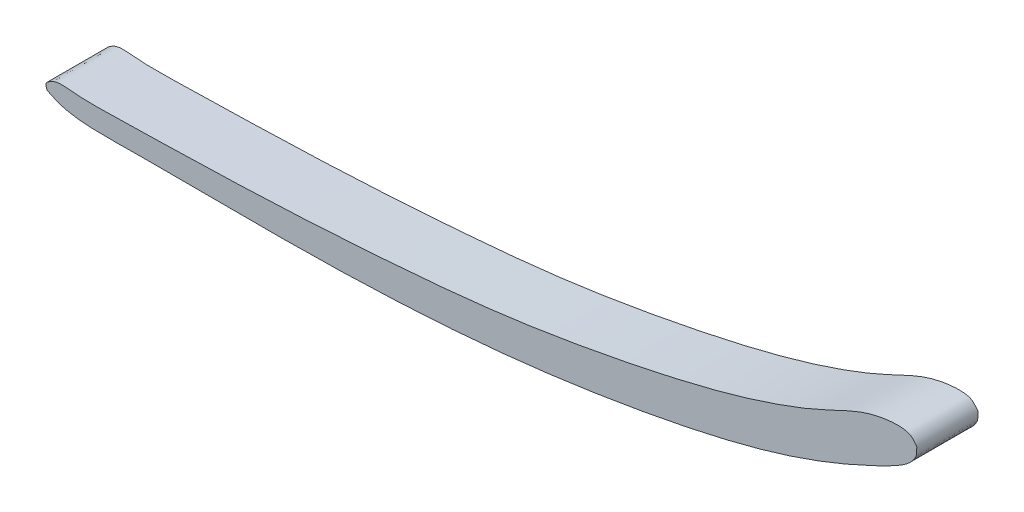
ISO-10303-21;
HEADER;
FILE_DESCRIPTION(('STEP AP214'),'2;1');
FILE_NAME('part.step','',(''),(''),'','','');
FILE_SCHEMA(('AUTOMOTIVE_DESIGN { 1 0 10303 214 1 1 1 1 }'));
ENDSEC;
DATA;
#1=APPLICATION_CONTEXT('core data for automotive mechanical design processes');
#2=APPLICATION_PROTOCOL_DEFINITION('international standard','automotive_design',2000,#1);
#3=PRODUCT_CONTEXT('',#1,'mechanical');
#4=PRODUCT('Part','Part','',(#3));
#5=PRODUCT_RELATED_PRODUCT_CATEGORY('part','',(#4));
#6=PRODUCT_DEFINITION_FORMATION('','',#4);
#7=PRODUCT_DEFINITION_CONTEXT('part definition',#1,'design');
#8=PRODUCT_DEFINITION('design','',#6,#7);
#9=PRODUCT_DEFINITION_SHAPE('','',#8);
#10=(LENGTH_UNIT() NAMED_UNIT(*) SI_UNIT(.MILLI.,.METRE.));
#11=(NAMED_UNIT(*) PLANE_ANGLE_UNIT() SI_UNIT($,.RADIAN.));
#12=(NAMED_UNIT(*) SI_UNIT($,.STERADIAN.) SOLID_ANGLE_UNIT());
#13=UNCERTAINTY_MEASURE_WITH_UNIT(LENGTH_MEASURE(1.E-05),#10,'distance_accuracy_value','');
#14=(GEOMETRIC_REPRESENTATION_CONTEXT(3) GLOBAL_UNCERTAINTY_ASSIGNED_CONTEXT((#13)) GLOBAL_UNIT_ASSIGNED_CONTEXT((#10,
#11,#12)) REPRESENTATION_CONTEXT('',''));
#15=CARTESIAN_POINT('',(0.,0.,0.));
#16=DIRECTION('',(0.,0.,1.));
#17=DIRECTION('',(1.,0.,0.));
#18=AXIS2_PLACEMENT_3D('',#15,#16,#17);
#19=CARTESIAN_POINT('',(55.5241101869272,0.,428.));
#20=CARTESIAN_POINT('',(55.5039687873424,0.0755649342090992,428.));
#21=CARTESIAN_POINT('',(55.4579059639859,0.138431266894196,428.));
#22=CARTESIAN_POINT('',(55.3605634970154,0.258055245085292,428.));
#23=CARTESIAN_POINT('',(55.3083662094375,0.314783204435981,428.));
#24=CARTESIAN_POINT('',(55.1551918050011,0.487956129951284,428.));
#25=CARTESIAN_POINT('',(55.0540083751696,0.605502569513083,428.));
#26=CARTESIAN_POINT('',(54.8851457962373,0.761160378942832,428.));
#27=CARTESIAN_POINT('',(54.8265218751564,0.809950506927143,428.));
#28=CARTESIAN_POINT('',(54.7007468717873,0.896231962531441,428.));
#29=CARTESIAN_POINT('',(54.6336053700598,0.934008635710387,428.));
#30=CARTESIAN_POINT('',(54.4223752737609,1.03265853811213,428.));
#31=CARTESIAN_POINT('',(54.2754979851669,1.07607449103039,428.));
#32=CARTESIAN_POINT('',(53.9758774109309,1.14126136101381,428.));
#33=CARTESIAN_POINT('',(53.8223867026494,1.16250959131756,428.));
#34=CARTESIAN_POINT('',(53.5170456275914,1.19288651015392,428.));
#35=CARTESIAN_POINT('',(53.3645750986754,1.20190797907316,428.));
#36=CARTESIAN_POINT('',(52.9076973855463,1.21251112705606,428.));
#37=CARTESIAN_POINT('',(52.6037868262057,1.19878006121862,428.));
#38=CARTESIAN_POINT('',(51.6930020854311,1.12838935605838,428.));
#39=CARTESIAN_POINT('',(51.084810477807,1.03752236294494,428.));
#40=CARTESIAN_POINT('',(49.8965345676776,0.791512748186868,428.));
#41=CARTESIAN_POINT('',(49.3138572535747,0.634105818671404,428.));
#42=CARTESIAN_POINT('',(47.5985316170088,0.0637084684002864,428.));
#43=CARTESIAN_POINT('',(46.4961480600388,-0.440458586462578,428.));
#44=CARTESIAN_POINT('',(44.8490607438576,-1.21513355037381,428.));
#45=CARTESIAN_POINT('',(44.3008299873136,-1.47544225045362,428.));
#46=CARTESIAN_POINT('',(43.1994630058059,-1.98325624524551,428.));
#47=CARTESIAN_POINT('',(42.6468304723215,-2.23207618835394,428.));
#48=CARTESIAN_POINT('',(40.9781638905592,-2.95042868494433,428.));
#49=CARTESIAN_POINT('',(39.8512956384992,-3.39168367327106,428.));
#50=CARTESIAN_POINT('',(37.578628138799,-4.22478323899539,428.));
#51=CARTESIAN_POINT('',(36.4329452154887,-4.61693142604294,428.));
#52=CARTESIAN_POINT('',(34.1274221954572,-5.36427719429847,428.));
#53=CARTESIAN_POINT('',(32.9666828933141,-5.71905195485073,428.));
#54=CARTESIAN_POINT('',(30.6342441364514,-6.38927625023719,428.));
#55=CARTESIAN_POINT('',(29.4628823005357,-6.70514157591048,428.));
#56=CARTESIAN_POINT('',(25.9367571648955,-7.60767649487631,428.));
#57=CARTESIAN_POINT('',(23.5712166740636,-8.15264729919288,428.));
#58=CARTESIAN_POINT('',(18.8278364564787,-9.1732903639675,428.));
#59=CARTESIAN_POINT('',(16.448287175847,-9.64592772268644,428.));
#60=CARTESIAN_POINT('',(11.6764948518323,-10.5303367446281,428.));
#61=CARTESIAN_POINT('',(9.28492343473535,-10.9432039019325,428.));
#62=CARTESIAN_POINT('',(4.48907149846664,-11.6887025090073,428.));
#63=CARTESIAN_POINT('',(2.08529180844834,-12.019190961239,428.));
#64=CARTESIAN_POINT('',(-2.73179096615529,-12.5932546533935,428.));
#65=CARTESIAN_POINT('',(-5.14533236546347,-12.8380837913012,428.));
#66=CARTESIAN_POINT('',(-9.97875737783331,-13.2740810481595,428.));
#67=CARTESIAN_POINT('',(-12.3970207746931,-13.466191756796,428.));
#68=CARTESIAN_POINT('',(-19.6544823660947,-13.9979320804965,428.));
#69=CARTESIAN_POINT('',(-24.4969111832703,-14.2836351996572,428.));
#70=CARTESIAN_POINT('',(-34.1914806969688,-14.6929279133763,428.));
#71=CARTESIAN_POINT('',(-39.0431108084712,-14.8234206202054,428.));
#72=CARTESIAN_POINT('',(-45.1069970098435,-14.9777668264297,428.));
#73=CARTESIAN_POINT('',(-46.3197835840583,-15.0083576021695,428.));
#74=CARTESIAN_POINT('',(-48.1390882591536,-15.0487569821237,428.));
#75=CARTESIAN_POINT('',(-48.7455570167024,-15.0607634014249,428.));
#76=CARTESIAN_POINT('',(-49.9584916579208,-15.0846898163827,428.));
#77=CARTESIAN_POINT('',(-50.5649400063732,-15.0979041281796,428.));
#78=CARTESIAN_POINT('',(-51.7780269297727,-15.1117884115737,428.));
#79=CARTESIAN_POINT('',(-52.3849351242052,-15.1121962071007,428.));
#80=CARTESIAN_POINT('',(-53.2935149101566,-15.0831791591262,428.));
#81=CARTESIAN_POINT('',(-53.5961508109509,-15.0693060901934,428.));
#82=CARTESIAN_POINT('',(-54.200885719848,-15.0314927415106,428.));
#83=CARTESIAN_POINT('',(-54.5029175413797,-15.0062926543813,428.));
#84=CARTESIAN_POINT('',(-55.1067389591979,-14.9513505434428,428.));
#85=CARTESIAN_POINT('',(-55.4091025441298,-14.923831893448,428.));
#86=CARTESIAN_POINT('',(-56.0127132460807,-14.8959501880909,428.));
#87=CARTESIAN_POINT('',(-56.3138725543252,-14.8923965722149,428.));
#88=CARTESIAN_POINT('',(-56.7622635047172,-14.9408963232973,428.));
#89=CARTESIAN_POINT('',(-56.9111432646791,-14.9664508393356,428.));
#90=CARTESIAN_POINT('',(-57.2069433913444,-15.0490634868704,428.));
#91=CARTESIAN_POINT('',(-57.3508417748024,-15.1079344428502,428.));
#92=CARTESIAN_POINT('',(-57.6214053279722,-15.2497534139825,428.));
#93=CARTESIAN_POINT('',(-57.7511773704568,-15.3310091452717,428.));
#94=CARTESIAN_POINT('',(-57.9410907916566,-15.4618022896647,428.));
#95=CARTESIAN_POINT('',(-58.0054733234216,-15.5041331131043,428.));
#96=CARTESIAN_POINT('',(-58.095253134219,-15.5765950370453,428.));
#97=CARTESIAN_POINT('',(-58.1237349673642,-15.603128724098,428.));
#98=CARTESIAN_POINT('',(-58.1710333968758,-15.6629769537141,428.));
#99=CARTESIAN_POINT('',(-58.1902863516003,-15.6970180572569,428.));
#100=CARTESIAN_POINT('',(-58.2330708695906,-15.8037402580153,428.));
#101=CARTESIAN_POINT('',(-58.2401850941399,-15.8821367442861,428.));
#102=CARTESIAN_POINT('',(-58.2306954632788,-16.0339221352164,428.));
#103=CARTESIAN_POINT('',(-58.2206782893337,-16.1100687085202,428.));
#104=CARTESIAN_POINT('',(-58.1919029502724,-16.2589901596816,428.));
#105=CARTESIAN_POINT('',(-58.1714857417287,-16.3325248019363,428.));
#106=CARTESIAN_POINT('',(-58.0911528389471,-16.4651027388792,428.));
#107=CARTESIAN_POINT('',(-58.0285334456799,-16.514102901296,428.));
#108=CARTESIAN_POINT('',(-57.8926625308949,-16.5862323010828,428.));
#109=CARTESIAN_POINT('',(-57.819800474012,-16.6135500993979,428.));
#110=CARTESIAN_POINT('',(-57.6772097987588,-16.6734708117086,428.));
#111=CARTESIAN_POINT('',(-57.6068558558812,-16.7055698567308,428.));
#112=CARTESIAN_POINT('',(-57.3968044890797,-16.8041625893363,428.));
#113=CARTESIAN_POINT('',(-57.2584142368658,-16.8740109172014,428.));
#114=CARTESIAN_POINT('',(-56.8393903336288,-17.0737690068558,428.));
#115=CARTESIAN_POINT('',(-56.5509296679753,-17.1833304422405,428.));
#116=CARTESIAN_POINT('',(-55.9590720550717,-17.3637484973703,428.));
#117=CARTESIAN_POINT('',(-55.6566902637885,-17.4376988714857,428.));
#118=CARTESIAN_POINT('',(-54.7472256476605,-17.6317375907059,428.));
#119=CARTESIAN_POINT('',(-54.1309978507017,-17.718433238566,428.));
#120=CARTESIAN_POINT('',(-52.89835479118,-17.8290920550492,428.));
#121=CARTESIAN_POINT('',(-52.2813335264445,-17.8553712496273,428.));
#122=CARTESIAN_POINT('',(-51.0467338603446,-17.8847995413973,428.));
#123=CARTESIAN_POINT('',(-50.4291201896878,-17.8864843978139,428.));
#124=CARTESIAN_POINT('',(-49.1937303795221,-17.8831090499672,428.));
#125=CARTESIAN_POINT('',(-48.5759484244507,-17.877807406676,428.));
#126=CARTESIAN_POINT('',(-46.7225610897722,-17.8601808295384,428.));
#127=CARTESIAN_POINT('',(-45.48696411993,-17.8482964698079,428.));
#128=CARTESIAN_POINT('',(-41.7801204418174,-17.8338325420042,428.));
#129=CARTESIAN_POINT('',(-39.3088173168778,-17.8487313434939,428.));
#130=CARTESIAN_POINT('',(-34.3662691102635,-17.8772537023221,428.));
#131=CARTESIAN_POINT('',(-31.8949923200814,-17.8901066096142,428.));
#132=CARTESIAN_POINT('',(-26.9523694366659,-17.8794886073522,428.));
#133=CARTESIAN_POINT('',(-24.4809458640961,-17.8578462742223,428.));
#134=CARTESIAN_POINT('',(-19.5396800418516,-17.7652613402034,428.));
#135=CARTESIAN_POINT('',(-17.0697006729411,-17.6935289467973,428.));
#136=CARTESIAN_POINT('',(-9.66197492036624,-17.3922131870847,428.));
#137=CARTESIAN_POINT('',(-4.72955098907546,-17.0738970466577,428.));
#138=CARTESIAN_POINT('',(5.11132900513372,-16.1311342991007,428.));
#139=CARTESIAN_POINT('',(10.0136924186828,-15.5033245485869,428.));
#140=CARTESIAN_POINT('',(17.336617442486,-14.3412967390595,428.));
#141=CARTESIAN_POINT('',(19.7711034256445,-13.9193371710834,428.));
#142=CARTESIAN_POINT('',(24.6248877209946,-12.994396450314,428.));
#143=CARTESIAN_POINT('',(27.0454386668107,-12.4921714665117,428.));
#144=CARTESIAN_POINT('',(31.8602385182995,-11.3758021009177,428.));
#145=CARTESIAN_POINT('',(34.2526513302452,-10.7600669186458,428.));
#146=CARTESIAN_POINT('',(38.9922378777209,-9.35487855352457,428.));
#147=CARTESIAN_POINT('',(41.3346383675589,-8.56324263122049,428.));
#148=CARTESIAN_POINT('',(45.9455856080809,-6.77620240277177,428.));
#149=CARTESIAN_POINT('',(48.2102981852841,-5.78100077796156,428.));
#150=CARTESIAN_POINT('',(50.995254164702,-4.44071216136221,428.));
#151=CARTESIAN_POINT('',(51.5499895120356,-4.16785449739332,428.));
#152=CARTESIAN_POINT('',(52.372723459987,-3.74048074201849,428.));
#153=CARTESIAN_POINT('',(52.6453238017285,-3.59430546769746,428.));
#154=CARTESIAN_POINT('',(53.1828698084947,-3.28971836328906,428.));
#155=CARTESIAN_POINT('',(53.4481676454802,-3.13206244172845,428.));
#156=CARTESIAN_POINT('',(53.9633932973974,-2.7930338248362,428.));
#157=CARTESIAN_POINT('',(54.2141093104932,-2.61093704863471,428.));
#158=CARTESIAN_POINT('',(54.6844343118432,-2.20739987550622,428.));
#159=CARTESIAN_POINT('',(54.9021581341447,-1.98526290543802,428.));
#160=CARTESIAN_POINT('',(55.1823238946681,-1.61475271043904,428.));
#161=CARTESIAN_POINT('',(55.2674630299987,-1.48618062945347,428.));
#162=CARTESIAN_POINT('',(55.4095911539225,-1.21174026781964,428.));
#163=CARTESIAN_POINT('',(55.4669619778456,-1.06381210532594,428.));
#164=CARTESIAN_POINT('',(55.5222160557924,-0.764675129334758,428.));
#165=CARTESIAN_POINT('',(55.5209506855047,-0.611238906165046,428.));
#166=CARTESIAN_POINT('',(55.5229807172447,-0.381610411979205,428.));
#167=CARTESIAN_POINT('',(55.5271011341633,-0.305369634226366,428.));
#168=CARTESIAN_POINT('',(55.536589557388,-0.15270057493566,428.));
#169=CARTESIAN_POINT('',(55.544251586512,-0.0755649342090992,428.));
#170=CARTESIAN_POINT('',(55.5241101869272,0.,428.));
#171=B_SPLINE_CURVE_WITH_KNOTS('',3,(#19,#20,#21,#22,#23,#24,#25,#26,#27,#28,#29,#30,#31,#32,
#33,#34,#35,#36,#37,#38,#39,#40,#41,#42,#43,#44,#45,#46,#47,#48,#49,#50,#51,#52,#53,#54,#55,#56,
#57,#58,#59,#60,#61,#62,#63,#64,#65,#66,#67,#68,#69,#70,#71,#72,#73,#74,#75,#76,#77,#78,#79,#80,
#81,#82,#83,#84,#85,#86,#87,#88,#89,#90,#91,#92,#93,#94,#95,#96,#97,#98,#99,#100,#101,#102,#103,
#104,#105,#106,#107,#108,#109,#110,#111,#112,#113,#114,#115,#116,#117,#118,#119,#120,#121,#122,
#123,#124,#125,#126,#127,#128,#129,#130,#131,#132,#133,#134,#135,#136,#137,#138,#139,#140,#141,
#142,#143,#144,#145,#146,#147,#148,#149,#150,#151,#152,#153,#154,#155,#156,#157,#158,#159,#160,
#161,#162,#163,#164,#165,#166,#167,#168,#169,#170),.UNSPECIFIED.,.T.,.F.,(4,2,2,2,2,2,2,2,2,2,2,
2,2,2,2,2,2,2,2,2,2,2,2,2,2,2,2,2,2,2,2,2,2,2,2,2,2,2,2,2,2,2,2,2,2,2,2,2,2,2,2,2,2,2,2,2,2,2,2,
2,2,2,2,2,2,2,2,2,2,2,2,2,2,2,2,4),(0.,0.000976562499999918,0.00195312499999984,
0.00390624999999973,0.00488281249999971,0.00585937499999969,0.00781249999999965,
0.00976562499999961,0.0117187499999996,0.0156249999999995,0.0234374999999992,0.031249999999999,
0.0468749999999985,0.0546874999999982,0.062499999999998,0.0781249999999975,0.093749999999997,
0.109374999999996,0.124999999999996,0.156249999999995,0.187499999999994,0.218749999999993,
0.249999999999992,0.281249999999991,0.312499999999991,0.374999999999989,0.437499999999987,
0.453124999999986,0.460937499999986,0.468749999999986,0.476562499999985,0.480468749999985,
0.484374999999985,0.488281249999985,0.492187499999985,0.494140624999985,0.496093749999985,
0.498046874999985,0.499023437499985,0.499511718749985,0.499999999999985,0.500976562499985,
0.501953124999985,0.502929687499985,0.503906249999985,0.504882812499985,0.505859374999985,
0.507812499999985,0.511718749999985,0.515624999999985,0.523437499999986,0.531249999999986,
0.539062499999986,0.546874999999987,0.562499999999987,0.593749999999988,0.624999999999989,
0.65624999999999,0.687499999999991,0.749999999999993,0.812499999999994,0.843749999999995,
0.874999999999996,0.906249999999997,0.937499999999998,0.968749999999999,0.976562499999999,
0.980468749999999,0.984374999999999,0.98828125,0.9921875,0.994140625,0.99609375,0.998046875,
0.9990234375,1.),.UNSPECIFIED.);
#172=DIRECTION('',(0.,0.,-1.));
#173=VECTOR('',#172,1.);
#174=SURFACE_OF_LINEAR_EXTRUSION('',#171,#173);
#175=CARTESIAN_POINT('',(55.5241101869272,0.,428.));
#176=CARTESIAN_POINT('',(55.544251586512,-0.0755649342090992,428.));
#177=CARTESIAN_POINT('',(55.536589557388,-0.15270057493566,428.));
#178=CARTESIAN_POINT('',(55.5271011341633,-0.305369634226366,428.));
#179=CARTESIAN_POINT('',(55.5229807172447,-0.381610411979205,428.));
#180=CARTESIAN_POINT('',(55.5209506855047,-0.611238906165046,428.));
#181=CARTESIAN_POINT('',(55.5222160557924,-0.764675129334758,428.));
#182=CARTESIAN_POINT('',(55.4669619778456,-1.06381210532594,428.));
#183=CARTESIAN_POINT('',(55.4095911539225,-1.21174026781964,428.));
#184=CARTESIAN_POINT('',(55.2674630299987,-1.48618062945347,428.));
#185=CARTESIAN_POINT('',(55.1823238946681,-1.61475271043904,428.));
#186=CARTESIAN_POINT('',(54.9021581341447,-1.98526290543802,428.));
#187=CARTESIAN_POINT('',(54.6844343118432,-2.20739987550622,428.));
#188=CARTESIAN_POINT('',(54.2141093104932,-2.61093704863471,428.));
#189=CARTESIAN_POINT('',(53.9633932973974,-2.7930338248362,428.));
#190=CARTESIAN_POINT('',(53.4481676454802,-3.13206244172845,428.));
#191=CARTESIAN_POINT('',(53.1828698084947,-3.28971836328906,428.));
#192=CARTESIAN_POINT('',(52.6453238017285,-3.59430546769746,428.));
#193=CARTESIAN_POINT('',(52.372723459987,-3.74048074201849,428.));
#194=CARTESIAN_POINT('',(51.5499895120356,-4.16785449739332,428.));
#195=CARTESIAN_POINT('',(50.995254164702,-4.44071216136221,428.));
#196=CARTESIAN_POINT('',(48.2102981852841,-5.78100077796156,428.));
#197=CARTESIAN_POINT('',(45.9455856080809,-6.77620240277177,428.));
#198=CARTESIAN_POINT('',(41.3346383675589,-8.56324263122049,428.));
#199=CARTESIAN_POINT('',(38.9922378777209,-9.35487855352457,428.));
#200=CARTESIAN_POINT('',(34.2526513302452,-10.7600669186458,428.));
#201=CARTESIAN_POINT('',(31.8602385182995,-11.3758021009177,428.));
#202=CARTESIAN_POINT('',(27.0454386668107,-12.4921714665117,428.));
#203=CARTESIAN_POINT('',(24.6248877209946,-12.994396450314,428.));
#204=CARTESIAN_POINT('',(19.7711034256445,-13.9193371710834,428.));
#205=CARTESIAN_POINT('',(17.336617442486,-14.3412967390595,428.));
#206=CARTESIAN_POINT('',(10.0136924186828,-15.5033245485869,428.));
#207=CARTESIAN_POINT('',(5.11132900513372,-16.1311342991007,428.));
#208=CARTESIAN_POINT('',(-4.72955098907546,-17.0738970466577,428.));
#209=CARTESIAN_POINT('',(-9.66197492036624,-17.3922131870847,428.));
#210=CARTESIAN_POINT('',(-17.0697006729411,-17.6935289467973,428.));
#211=CARTESIAN_POINT('',(-19.5396800418516,-17.7652613402034,428.));
#212=CARTESIAN_POINT('',(-24.4809458640961,-17.8578462742223,428.));
#213=CARTESIAN_POINT('',(-26.9523694366659,-17.8794886073522,428.));
#214=CARTESIAN_POINT('',(-31.8949923200814,-17.8901066096142,428.));
#215=CARTESIAN_POINT('',(-34.3662691102635,-17.8772537023221,428.));
#216=CARTESIAN_POINT('',(-39.3088173168778,-17.8487313434939,428.));
#217=CARTESIAN_POINT('',(-41.7801204418174,-17.8338325420042,428.));
#218=CARTESIAN_POINT('',(-45.48696411993,-17.8482964698079,428.));
#219=CARTESIAN_POINT('',(-46.7225610897722,-17.8601808295384,428.));
#220=CARTESIAN_POINT('',(-48.5759484244507,-17.877807406676,428.));
#221=CARTESIAN_POINT('',(-49.1937303795221,-17.8831090499672,428.));
#222=CARTESIAN_POINT('',(-50.4291201896878,-17.8864843978139,428.));
#223=CARTESIAN_POINT('',(-51.0467338603446,-17.8847995413973,428.));
#224=CARTESIAN_POINT('',(-52.2813335264445,-17.8553712496273,428.));
#225=CARTESIAN_POINT('',(-52.89835479118,-17.8290920550492,428.));
#226=CARTESIAN_POINT('',(-54.1309978507017,-17.718433238566,428.));
#227=CARTESIAN_POINT('',(-54.7472256476605,-17.6317375907059,428.));
#228=CARTESIAN_POINT('',(-55.6566902637885,-17.4376988714857,428.));
#229=CARTESIAN_POINT('',(-55.9590720550717,-17.3637484973703,428.));
#230=CARTESIAN_POINT('',(-56.5509296679753,-17.1833304422405,428.));
#231=CARTESIAN_POINT('',(-56.8393903336288,-17.0737690068558,428.));
#232=CARTESIAN_POINT('',(-57.2584142368658,-16.8740109172014,428.));
#233=CARTESIAN_POINT('',(-57.3968044890797,-16.8041625893363,428.));
#234=CARTESIAN_POINT('',(-57.6068558558812,-16.7055698567308,428.));
#235=CARTESIAN_POINT('',(-57.6772097987588,-16.6734708117086,428.));
#236=CARTESIAN_POINT('',(-57.819800474012,-16.6135500993979,428.));
#237=CARTESIAN_POINT('',(-57.8926625308949,-16.5862323010828,428.));
#238=CARTESIAN_POINT('',(-58.0285334456799,-16.514102901296,428.));
#239=CARTESIAN_POINT('',(-58.0911528389471,-16.4651027388792,428.));
#240=CARTESIAN_POINT('',(-58.1714857417287,-16.3325248019363,428.));
#241=CARTESIAN_POINT('',(-58.1919029502724,-16.2589901596816,428.));
#242=CARTESIAN_POINT('',(-58.2206782893337,-16.1100687085202,428.));
#243=CARTESIAN_POINT('',(-58.2306954632788,-16.0339221352164,428.));
#244=CARTESIAN_POINT('',(-58.2401850941399,-15.8821367442861,428.));
#245=CARTESIAN_POINT('',(-58.2330708695906,-15.8037402580153,428.));
#246=CARTESIAN_POINT('',(-58.1902863516003,-15.6970180572569,428.));
#247=CARTESIAN_POINT('',(-58.1710333968758,-15.6629769537141,428.));
#248=CARTESIAN_POINT('',(-58.1237349673642,-15.603128724098,428.));
#249=CARTESIAN_POINT('',(-58.095253134219,-15.5765950370453,428.));
#250=CARTESIAN_POINT('',(-58.0054733234216,-15.5041331131043,428.));
#251=CARTESIAN_POINT('',(-57.9410907916566,-15.4618022896647,428.));
#252=CARTESIAN_POINT('',(-57.7511773704568,-15.3310091452717,428.));
#253=CARTESIAN_POINT('',(-57.6214053279722,-15.2497534139825,428.));
#254=CARTESIAN_POINT('',(-57.3508417748024,-15.1079344428502,428.));
#255=CARTESIAN_POINT('',(-57.2069433913444,-15.0490634868704,428.));
#256=CARTESIAN_POINT('',(-56.9111432646791,-14.9664508393356,428.));
#257=CARTESIAN_POINT('',(-56.7622635047172,-14.9408963232973,428.));
#258=CARTESIAN_POINT('',(-56.3138725543252,-14.8923965722149,428.));
#259=CARTESIAN_POINT('',(-56.0127132460807,-14.8959501880909,428.));
#260=CARTESIAN_POINT('',(-55.4091025441298,-14.923831893448,428.));
#261=CARTESIAN_POINT('',(-55.1067389591979,-14.9513505434428,428.));
#262=CARTESIAN_POINT('',(-54.5029175413797,-15.0062926543813,428.));
#263=CARTESIAN_POINT('',(-54.200885719848,-15.0314927415106,428.));
#264=CARTESIAN_POINT('',(-53.5961508109509,-15.0693060901934,428.));
#265=CARTESIAN_POINT('',(-53.2935149101566,-15.0831791591262,428.));
#266=CARTESIAN_POINT('',(-52.3849351242052,-15.1121962071007,428.));
#267=CARTESIAN_POINT('',(-51.7780269297727,-15.1117884115737,428.));
#268=CARTESIAN_POINT('',(-50.5649400063732,-15.0979041281796,428.));
#269=CARTESIAN_POINT('',(-49.9584916579208,-15.0846898163827,428.));
#270=CARTESIAN_POINT('',(-48.7455570167024,-15.0607634014249,428.));
#271=CARTESIAN_POINT('',(-48.1390882591536,-15.0487569821237,428.));
#272=CARTESIAN_POINT('',(-46.3197835840583,-15.0083576021695,428.));
#273=CARTESIAN_POINT('',(-45.1069970098435,-14.9777668264297,428.));
#274=CARTESIAN_POINT('',(-39.0431108084712,-14.8234206202054,428.));
#275=CARTESIAN_POINT('',(-34.1914806969688,-14.6929279133763,428.));
#276=CARTESIAN_POINT('',(-24.4969111832703,-14.2836351996572,428.));
#277=CARTESIAN_POINT('',(-19.6544823660947,-13.9979320804965,428.));
#278=CARTESIAN_POINT('',(-12.3970207746931,-13.466191756796,428.));
#279=CARTESIAN_POINT('',(-9.97875737783331,-13.2740810481595,428.));
#280=CARTESIAN_POINT('',(-5.14533236546347,-12.8380837913012,428.));
#281=CARTESIAN_POINT('',(-2.73179096615529,-12.5932546533935,428.));
#282=CARTESIAN_POINT('',(2.08529180844834,-12.019190961239,428.));
#283=CARTESIAN_POINT('',(4.48907149846664,-11.6887025090073,428.));
#284=CARTESIAN_POINT('',(9.28492343473535,-10.9432039019325,428.));
#285=CARTESIAN_POINT('',(11.6764948518323,-10.5303367446281,428.));
#286=CARTESIAN_POINT('',(16.448287175847,-9.64592772268644,428.));
#287=CARTESIAN_POINT('',(18.8278364564787,-9.1732903639675,428.));
#288=CARTESIAN_POINT('',(23.5712166740636,-8.15264729919288,428.));
#289=CARTESIAN_POINT('',(25.9367571648955,-7.60767649487631,428.));
#290=CARTESIAN_POINT('',(29.4628823005357,-6.70514157591048,428.));
#291=CARTESIAN_POINT('',(30.6342441364514,-6.38927625023719,428.));
#292=CARTESIAN_POINT('',(32.9666828933141,-5.71905195485073,428.));
#293=CARTESIAN_POINT('',(34.1274221954572,-5.36427719429847,428.));
#294=CARTESIAN_POINT('',(36.4329452154887,-4.61693142604294,428.));
#295=CARTESIAN_POINT('',(37.578628138799,-4.22478323899539,428.));
#296=CARTESIAN_POINT('',(39.8512956384992,-3.39168367327106,428.));
#297=CARTESIAN_POINT('',(40.9781638905592,-2.95042868494433,428.));
#298=CARTESIAN_POINT('',(42.6468304723215,-2.23207618835394,428.));
#299=CARTESIAN_POINT('',(43.1994630058059,-1.98325624524551,428.));
#300=CARTESIAN_POINT('',(44.3008299873136,-1.47544225045362,428.));
#301=CARTESIAN_POINT('',(44.8490607438576,-1.21513355037381,428.));
#302=CARTESIAN_POINT('',(46.4961480600388,-0.440458586462578,428.));
#303=CARTESIAN_POINT('',(47.5985316170088,0.0637084684002864,428.));
#304=CARTESIAN_POINT('',(49.3138572535747,0.634105818671404,428.));
#305=CARTESIAN_POINT('',(49.8965345676776,0.791512748186868,428.));
#306=CARTESIAN_POINT('',(51.084810477807,1.03752236294494,428.));
#307=CARTESIAN_POINT('',(51.6930020854311,1.12838935605838,428.));
#308=CARTESIAN_POINT('',(52.6037868262057,1.19878006121862,428.));
#309=CARTESIAN_POINT('',(52.9076973855463,1.21251112705606,428.));
#310=CARTESIAN_POINT('',(53.3645750986754,1.20190797907316,428.));
#311=CARTESIAN_POINT('',(53.5170456275914,1.19288651015392,428.));
#312=CARTESIAN_POINT('',(53.8223867026494,1.16250959131756,428.));
#313=CARTESIAN_POINT('',(53.9758774109309,1.14126136101381,428.));
#314=CARTESIAN_POINT('',(54.2754979851669,1.07607449103039,428.));
#315=CARTESIAN_POINT('',(54.4223752737609,1.03265853811213,428.));
#316=CARTESIAN_POINT('',(54.6336053700598,0.934008635710387,428.));
#317=CARTESIAN_POINT('',(54.7007468717873,0.896231962531441,428.));
#318=CARTESIAN_POINT('',(54.8265218751564,0.809950506927143,428.));
#319=CARTESIAN_POINT('',(54.8851457962373,0.761160378942832,428.));
#320=CARTESIAN_POINT('',(55.0540083751696,0.605502569513083,428.));
#321=CARTESIAN_POINT('',(55.1551918050011,0.487956129951284,428.));
#322=CARTESIAN_POINT('',(55.3083662094375,0.314783204435981,428.));
#323=CARTESIAN_POINT('',(55.3605634970154,0.258055245085292,428.));
#324=CARTESIAN_POINT('',(55.4579059639859,0.138431266894196,428.));
#325=CARTESIAN_POINT('',(55.5039687873424,0.0755649342090992,428.));
#326=CARTESIAN_POINT('',(55.5241101869272,0.,428.));
#327=B_SPLINE_CURVE_WITH_KNOTS('',3,(#175,#176,#177,#178,#179,#180,#181,#182,#183,#184,#185,
#186,#187,#188,#189,#190,#191,#192,#193,#194,#195,#196,#197,#198,#199,#200,#201,#202,#203,#204,
#205,#206,#207,#208,#209,#210,#211,#212,#213,#214,#215,#216,#217,#218,#219,#220,#221,#222,#223,
#224,#225,#226,#227,#228,#229,#230,#231,#232,#233,#234,#235,#236,#237,#238,#239,#240,#241,#242,
#243,#244,#245,#246,#247,#248,#249,#250,#251,#252,#253,#254,#255,#256,#257,#258,#259,#260,#261,
#262,#263,#264,#265,#266,#267,#268,#269,#270,#271,#272,#273,#274,#275,#276,#277,#278,#279,#280,
#281,#282,#283,#284,#285,#286,#287,#288,#289,#290,#291,#292,#293,#294,#295,#296,#297,#298,#299,
#300,#301,#302,#303,#304,#305,#306,#307,#308,#309,#310,#311,#312,#313,#314,#315,#316,#317,#318,
#319,#320,#321,#322,#323,#324,#325,#326),.UNSPECIFIED.,.T.,.F.,(4,2,2,2,2,2,2,2,2,2,2,2,2,2,2,2,
2,2,2,2,2,2,2,2,2,2,2,2,2,2,2,2,2,2,2,2,2,2,2,2,2,2,2,2,2,2,2,2,2,2,2,2,2,2,2,2,2,2,2,2,2,2,2,2,
2,2,2,2,2,2,2,2,2,2,2,4),(0.,0.000976562500000111,0.00195312500000022,0.00390625000000022,
0.00585937500000033,0.00781250000000033,0.0117187500000004,0.0156250000000006,
0.0195312500000007,0.0234375000000008,0.031250000000001,0.062500000000002,0.0937500000000029,
0.125000000000004,0.156250000000005,0.187500000000006,0.250000000000007,0.312500000000009,
0.34375000000001,0.375000000000011,0.406250000000012,0.437500000000013,0.453125000000013,
0.460937500000014,0.468750000000014,0.476562500000014,0.484375000000015,0.488281250000015,
0.492187500000015,0.494140625000015,0.495117187500015,0.496093750000015,0.497070312500015,
0.498046875000015,0.499023437500015,0.500000000000015,0.500488281250015,0.500976562500015,
0.501953125000015,0.503906250000015,0.505859375000015,0.507812500000015,0.511718750000015,
0.515625000000015,0.519531250000015,0.523437500000015,0.531250000000014,0.539062500000014,
0.546875000000014,0.562500000000013,0.625000000000011,0.68750000000001,0.718750000000009,
0.750000000000008,0.781250000000007,0.812500000000006,0.843750000000005,0.875000000000004,
0.890625000000004,0.906250000000003,0.921875000000003,0.937500000000002,0.945312500000002,
0.953125000000002,0.968750000000001,0.976562500000001,0.984375000000001,0.98828125,0.990234375,
0.9921875,0.994140625,0.9951171875,0.99609375,0.998046875,0.9990234375,1.),.UNSPECIFIED.);
#328=CARTESIAN_POINT('',(55.5241101869272,0.,428.));
#329=VERTEX_POINT('',#328);
#330=EDGE_CURVE('E10',#329,#329,#327,.F.);
#331=ORIENTED_EDGE('',*,*,#330,.F.);
#332=EDGE_LOOP('',(#331));
#333=FACE_BOUND('',#332,.T.);
#334=CARTESIAN_POINT('',(55.5241101869272,0.,420.000000000001));
#335=CARTESIAN_POINT('',(55.5039687873424,0.0755649342090992,420.000000000001));
#336=CARTESIAN_POINT('',(55.4579059639859,0.138431266894196,420.000000000001));
#337=CARTESIAN_POINT('',(55.3605634970154,0.258055245085292,420.000000000001));
#338=CARTESIAN_POINT('',(55.3083662094375,0.314783204435981,420.000000000001));
#339=CARTESIAN_POINT('',(55.1551918050011,0.487956129951284,420.000000000001));
#340=CARTESIAN_POINT('',(55.0540083751696,0.605502569513083,420.000000000001));
#341=CARTESIAN_POINT('',(54.8851457962373,0.761160378942832,420.000000000001));
#342=CARTESIAN_POINT('',(54.8265218751564,0.809950506927143,420.000000000001));
#343=CARTESIAN_POINT('',(54.7007468717873,0.896231962531441,420.000000000001));
#344=CARTESIAN_POINT('',(54.6336053700598,0.934008635710387,420.000000000001));
#345=CARTESIAN_POINT('',(54.4223752737609,1.03265853811213,420.000000000001));
#346=CARTESIAN_POINT('',(54.2754979851669,1.07607449103039,420.000000000001));
#347=CARTESIAN_POINT('',(53.9758774109309,1.14126136101381,420.000000000001));
#348=CARTESIAN_POINT('',(53.8223867026494,1.16250959131756,420.000000000001));
#349=CARTESIAN_POINT('',(53.5170456275914,1.19288651015392,420.000000000001));
#350=CARTESIAN_POINT('',(53.3645750986754,1.20190797907316,420.000000000001));
#351=CARTESIAN_POINT('',(52.9076973855463,1.21251112705606,420.000000000001));
#352=CARTESIAN_POINT('',(52.6037868262057,1.19878006121862,420.000000000001));
#353=CARTESIAN_POINT('',(51.6930020854311,1.12838935605838,420.000000000001));
#354=CARTESIAN_POINT('',(51.084810477807,1.03752236294494,420.000000000001));
#355=CARTESIAN_POINT('',(49.8965345676776,0.791512748186868,420.000000000001));
#356=CARTESIAN_POINT('',(49.3138572535747,0.634105818671404,420.000000000001));
#357=CARTESIAN_POINT('',(47.5985316170088,0.0637084684002864,420.000000000001));
#358=CARTESIAN_POINT('',(46.4961480600388,-0.440458586462578,420.000000000001));
#359=CARTESIAN_POINT('',(44.8490607438576,-1.21513355037381,420.000000000001));
#360=CARTESIAN_POINT('',(44.3008299873136,-1.47544225045362,420.000000000001));
#361=CARTESIAN_POINT('',(43.1994630058059,-1.98325624524551,420.000000000001));
#362=CARTESIAN_POINT('',(42.6468304723215,-2.23207618835394,420.000000000001));
#363=CARTESIAN_POINT('',(40.9781638905592,-2.95042868494433,420.000000000001));
#364=CARTESIAN_POINT('',(39.8512956384992,-3.39168367327106,420.000000000001));
#365=CARTESIAN_POINT('',(37.578628138799,-4.22478323899539,420.000000000001));
#366=CARTESIAN_POINT('',(36.4329452154887,-4.61693142604294,420.000000000001));
#367=CARTESIAN_POINT('',(34.1274221954572,-5.36427719429847,420.000000000001));
#368=CARTESIAN_POINT('',(32.9666828933141,-5.71905195485073,420.000000000001));
#369=CARTESIAN_POINT('',(30.6342441364514,-6.38927625023719,420.000000000001));
#370=CARTESIAN_POINT('',(29.4628823005357,-6.70514157591048,420.000000000001));
#371=CARTESIAN_POINT('',(25.9367571648955,-7.60767649487631,420.000000000001));
#372=CARTESIAN_POINT('',(23.5712166740636,-8.15264729919288,420.000000000001));
#373=CARTESIAN_POINT('',(18.8278364564787,-9.1732903639675,420.000000000001));
#374=CARTESIAN_POINT('',(16.448287175847,-9.64592772268644,420.000000000001));
#375=CARTESIAN_POINT('',(11.6764948518323,-10.5303367446281,420.000000000001));
#376=CARTESIAN_POINT('',(9.28492343473535,-10.9432039019325,420.000000000001));
#377=CARTESIAN_POINT('',(4.48907149846664,-11.6887025090073,420.000000000001));
#378=CARTESIAN_POINT('',(2.08529180844834,-12.019190961239,420.000000000001));
#379=CARTESIAN_POINT('',(-2.73179096615529,-12.5932546533935,420.000000000001));
#380=CARTESIAN_POINT('',(-5.14533236546347,-12.8380837913012,420.000000000001));
#381=CARTESIAN_POINT('',(-9.97875737783331,-13.2740810481595,420.000000000001));
#382=CARTESIAN_POINT('',(-12.3970207746931,-13.466191756796,420.000000000001));
#383=CARTESIAN_POINT('',(-19.6544823660947,-13.9979320804965,420.000000000001));
#384=CARTESIAN_POINT('',(-24.4969111832703,-14.2836351996572,420.000000000001));
#385=CARTESIAN_POINT('',(-34.1914806969688,-14.6929279133763,420.000000000001));
#386=CARTESIAN_POINT('',(-39.0431108084712,-14.8234206202054,420.000000000001));
#387=CARTESIAN_POINT('',(-45.1069970098435,-14.9777668264297,420.000000000001));
#388=CARTESIAN_POINT('',(-46.3197835840583,-15.0083576021695,420.000000000001));
#389=CARTESIAN_POINT('',(-48.1390882591536,-15.0487569821237,420.000000000001));
#390=CARTESIAN_POINT('',(-48.7455570167024,-15.0607634014249,420.000000000001));
#391=CARTESIAN_POINT('',(-49.9584916579208,-15.0846898163827,420.000000000001));
#392=CARTESIAN_POINT('',(-50.5649400063732,-15.0979041281796,420.000000000001));
#393=CARTESIAN_POINT('',(-51.7780269297727,-15.1117884115737,420.000000000001));
#394=CARTESIAN_POINT('',(-52.3849351242052,-15.1121962071007,420.000000000001));
#395=CARTESIAN_POINT('',(-53.2935149101566,-15.0831791591262,420.000000000001));
#396=CARTESIAN_POINT('',(-53.5961508109509,-15.0693060901934,420.000000000001));
#397=CARTESIAN_POINT('',(-54.200885719848,-15.0314927415106,420.000000000001));
#398=CARTESIAN_POINT('',(-54.5029175413797,-15.0062926543813,420.000000000001));
#399=CARTESIAN_POINT('',(-55.1067389591979,-14.9513505434428,420.000000000001));
#400=CARTESIAN_POINT('',(-55.4091025441298,-14.923831893448,420.000000000001));
#401=CARTESIAN_POINT('',(-56.0127132460807,-14.8959501880909,420.000000000001));
#402=CARTESIAN_POINT('',(-56.3138725543252,-14.8923965722149,420.000000000001));
#403=CARTESIAN_POINT('',(-56.7622635047172,-14.9408963232973,420.000000000001));
#404=CARTESIAN_POINT('',(-56.9111432646791,-14.9664508393356,420.000000000001));
#405=CARTESIAN_POINT('',(-57.2069433913444,-15.0490634868704,420.000000000001));
#406=CARTESIAN_POINT('',(-57.3508417748024,-15.1079344428502,420.000000000001));
#407=CARTESIAN_POINT('',(-57.6214053279722,-15.2497534139825,420.000000000001));
#408=CARTESIAN_POINT('',(-57.7511773704568,-15.3310091452717,420.000000000001));
#409=CARTESIAN_POINT('',(-57.9410907916566,-15.4618022896647,420.000000000001));
#410=CARTESIAN_POINT('',(-58.0054733234216,-15.5041331131043,420.000000000001));
#411=CARTESIAN_POINT('',(-58.095253134219,-15.5765950370453,420.000000000001));
#412=CARTESIAN_POINT('',(-58.1237349673642,-15.603128724098,420.000000000001));
#413=CARTESIAN_POINT('',(-58.1710333968758,-15.6629769537141,420.000000000001));
#414=CARTESIAN_POINT('',(-58.1902863516003,-15.6970180572569,420.000000000001));
#415=CARTESIAN_POINT('',(-58.2330708695906,-15.8037402580153,420.000000000001));
#416=CARTESIAN_POINT('',(-58.2401850941399,-15.8821367442861,420.000000000001));
#417=CARTESIAN_POINT('',(-58.2306954632788,-16.0339221352164,420.000000000001));
#418=CARTESIAN_POINT('',(-58.2206782893337,-16.1100687085202,420.000000000001));
#419=CARTESIAN_POINT('',(-58.1919029502724,-16.2589901596816,420.000000000001));
#420=CARTESIAN_POINT('',(-58.1714857417287,-16.3325248019363,420.000000000001));
#421=CARTESIAN_POINT('',(-58.0911528389471,-16.4651027388792,420.000000000001));
#422=CARTESIAN_POINT('',(-58.0285334456799,-16.514102901296,420.000000000001));
#423=CARTESIAN_POINT('',(-57.8926625308949,-16.5862323010828,420.000000000001));
#424=CARTESIAN_POINT('',(-57.819800474012,-16.6135500993979,420.000000000001));
#425=CARTESIAN_POINT('',(-57.6772097987588,-16.6734708117086,420.000000000001));
#426=CARTESIAN_POINT('',(-57.6068558558812,-16.7055698567308,420.000000000001));
#427=CARTESIAN_POINT('',(-57.3968044890797,-16.8041625893363,420.000000000001));
#428=CARTESIAN_POINT('',(-57.2584142368658,-16.8740109172014,420.000000000001));
#429=CARTESIAN_POINT('',(-56.8393903336288,-17.0737690068558,420.000000000001));
#430=CARTESIAN_POINT('',(-56.5509296679753,-17.1833304422405,420.000000000001));
#431=CARTESIAN_POINT('',(-55.9590720550717,-17.3637484973703,420.000000000001));
#432=CARTESIAN_POINT('',(-55.6566902637885,-17.4376988714857,420.000000000001));
#433=CARTESIAN_POINT('',(-54.7472256476605,-17.6317375907059,420.000000000001));
#434=CARTESIAN_POINT('',(-54.1309978507017,-17.718433238566,420.000000000001));
#435=CARTESIAN_POINT('',(-52.89835479118,-17.8290920550492,420.000000000001));
#436=CARTESIAN_POINT('',(-52.2813335264445,-17.8553712496273,420.000000000001));
#437=CARTESIAN_POINT('',(-51.0467338603446,-17.8847995413973,420.000000000001));
#438=CARTESIAN_POINT('',(-50.4291201896878,-17.8864843978139,420.000000000001));
#439=CARTESIAN_POINT('',(-49.1937303795221,-17.8831090499672,420.000000000001));
#440=CARTESIAN_POINT('',(-48.5759484244507,-17.877807406676,420.000000000001));
#441=CARTESIAN_POINT('',(-46.7225610897722,-17.8601808295384,420.000000000001));
#442=CARTESIAN_POINT('',(-45.48696411993,-17.8482964698079,420.000000000001));
#443=CARTESIAN_POINT('',(-41.7801204418174,-17.8338325420042,420.000000000001));
#444=CARTESIAN_POINT('',(-39.3088173168778,-17.8487313434939,420.000000000001));
#445=CARTESIAN_POINT('',(-34.3662691102635,-17.8772537023221,420.000000000001));
#446=CARTESIAN_POINT('',(-31.8949923200814,-17.8901066096142,420.000000000001));
#447=CARTESIAN_POINT('',(-26.9523694366659,-17.8794886073522,420.000000000001));
#448=CARTESIAN_POINT('',(-24.4809458640961,-17.8578462742223,420.000000000001));
#449=CARTESIAN_POINT('',(-19.5396800418516,-17.7652613402034,420.000000000001));
#450=CARTESIAN_POINT('',(-17.0697006729411,-17.6935289467973,420.000000000001));
#451=CARTESIAN_POINT('',(-9.66197492036624,-17.3922131870847,420.000000000001));
#452=CARTESIAN_POINT('',(-4.72955098907546,-17.0738970466577,420.000000000001));
#453=CARTESIAN_POINT('',(5.11132900513372,-16.1311342991007,420.000000000001));
#454=CARTESIAN_POINT('',(10.0136924186828,-15.5033245485869,420.000000000001));
#455=CARTESIAN_POINT('',(17.336617442486,-14.3412967390595,420.000000000001));
#456=CARTESIAN_POINT('',(19.7711034256445,-13.9193371710834,420.000000000001));
#457=CARTESIAN_POINT('',(24.6248877209946,-12.994396450314,420.000000000001));
#458=CARTESIAN_POINT('',(27.0454386668107,-12.4921714665117,420.000000000001));
#459=CARTESIAN_POINT('',(31.8602385182995,-11.3758021009177,420.000000000001));
#460=CARTESIAN_POINT('',(34.2526513302452,-10.7600669186458,420.000000000001));
#461=CARTESIAN_POINT('',(38.9922378777209,-9.35487855352457,420.000000000001));
#462=CARTESIAN_POINT('',(41.3346383675589,-8.56324263122049,420.000000000001));
#463=CARTESIAN_POINT('',(45.9455856080809,-6.77620240277177,420.000000000001));
#464=CARTESIAN_POINT('',(48.2102981852841,-5.78100077796156,420.000000000001));
#465=CARTESIAN_POINT('',(50.995254164702,-4.44071216136221,420.000000000001));
#466=CARTESIAN_POINT('',(51.5499895120356,-4.16785449739332,420.000000000001));
#467=CARTESIAN_POINT('',(52.372723459987,-3.74048074201849,420.000000000001));
#468=CARTESIAN_POINT('',(52.6453238017285,-3.59430546769746,420.000000000001));
#469=CARTESIAN_POINT('',(53.1828698084947,-3.28971836328906,420.000000000001));
#470=CARTESIAN_POINT('',(53.4481676454802,-3.13206244172845,420.000000000001));
#471=CARTESIAN_POINT('',(53.9633932973974,-2.7930338248362,420.000000000001));
#472=CARTESIAN_POINT('',(54.2141093104932,-2.61093704863471,420.000000000001));
#473=CARTESIAN_POINT('',(54.6844343118432,-2.20739987550622,420.000000000001));
#474=CARTESIAN_POINT('',(54.9021581341447,-1.98526290543802,420.000000000001));
#475=CARTESIAN_POINT('',(55.1823238946681,-1.61475271043904,420.000000000001));
#476=CARTESIAN_POINT('',(55.2674630299987,-1.48618062945347,420.000000000001));
#477=CARTESIAN_POINT('',(55.4095911539225,-1.21174026781964,420.000000000001));
#478=CARTESIAN_POINT('',(55.4669619778456,-1.06381210532594,420.000000000001));
#479=CARTESIAN_POINT('',(55.5222160557924,-0.764675129334758,420.000000000001));
#480=CARTESIAN_POINT('',(55.5209506855047,-0.611238906165046,420.000000000001));
#481=CARTESIAN_POINT('',(55.5229807172447,-0.381610411979205,420.000000000001));
#482=CARTESIAN_POINT('',(55.5271011341633,-0.305369634226366,420.000000000001));
#483=CARTESIAN_POINT('',(55.536589557388,-0.15270057493566,420.000000000001));
#484=CARTESIAN_POINT('',(55.544251586512,-0.0755649342090992,420.000000000001));
#485=CARTESIAN_POINT('',(55.5241101869272,0.,420.000000000001));
#486=B_SPLINE_CURVE_WITH_KNOTS('',3,(#334,#335,#336,#337,#338,#339,#340,#341,#342,#343,#344,
#345,#346,#347,#348,#349,#350,#351,#352,#353,#354,#355,#356,#357,#358,#359,#360,#361,#362,#363,
#364,#365,#366,#367,#368,#369,#370,#371,#372,#373,#374,#375,#376,#377,#378,#379,#380,#381,#382,
#383,#384,#385,#386,#387,#388,#389,#390,#391,#392,#393,#394,#395,#396,#397,#398,#399,#400,#401,
#402,#403,#404,#405,#406,#407,#408,#409,#410,#411,#412,#413,#414,#415,#416,#417,#418,#419,#420,
#421,#422,#423,#424,#425,#426,#427,#428,#429,#430,#431,#432,#433,#434,#435,#436,#437,#438,#439,
#440,#441,#442,#443,#444,#445,#446,#447,#448,#449,#450,#451,#452,#453,#454,#455,#456,#457,#458,
#459,#460,#461,#462,#463,#464,#465,#466,#467,#468,#469,#470,#471,#472,#473,#474,#475,#476,#477,
#478,#479,#480,#481,#482,#483,#484,#485),.UNSPECIFIED.,.T.,.F.,(4,2,2,2,2,2,2,2,2,2,2,2,2,2,2,2,
2,2,2,2,2,2,2,2,2,2,2,2,2,2,2,2,2,2,2,2,2,2,2,2,2,2,2,2,2,2,2,2,2,2,2,2,2,2,2,2,2,2,2,2,2,2,2,2,
2,2,2,2,2,2,2,2,2,2,2,4),(0.,0.000976562499999918,0.00195312499999984,0.00390624999999973,
0.00488281249999971,0.00585937499999969,0.00781249999999965,0.00976562499999961,
0.0117187499999996,0.0156249999999995,0.0234374999999992,0.031249999999999,0.0468749999999985,
0.0546874999999982,0.062499999999998,0.0781249999999975,0.093749999999997,0.109374999999996,
0.124999999999996,0.156249999999995,0.187499999999994,0.218749999999993,0.249999999999992,
0.281249999999991,0.312499999999991,0.374999999999989,0.437499999999987,0.453124999999986,
0.460937499999986,0.468749999999986,0.476562499999985,0.480468749999985,0.484374999999985,
0.488281249999985,0.492187499999985,0.494140624999985,0.496093749999985,0.498046874999985,
0.499023437499985,0.499511718749985,0.499999999999985,0.500976562499985,0.501953124999985,
0.502929687499985,0.503906249999985,0.504882812499985,0.505859374999985,0.507812499999985,
0.511718749999985,0.515624999999985,0.523437499999986,0.531249999999986,0.539062499999986,
0.546874999999987,0.562499999999987,0.593749999999988,0.624999999999989,0.65624999999999,
0.687499999999991,0.749999999999993,0.812499999999994,0.843749999999995,0.874999999999996,
0.906249999999997,0.937499999999998,0.968749999999999,0.976562499999999,0.980468749999999,
0.984374999999999,0.98828125,0.9921875,0.994140625,0.99609375,0.998046875,0.9990234375,1.),.UNSPECIFIED.);
#487=CARTESIAN_POINT('',(55.5241101869272,0.,420.000000000001));
#488=VERTEX_POINT('',#487);
#489=EDGE_CURVE('E38',#488,#488,#486,.T.);
#490=ORIENTED_EDGE('',*,*,#489,.T.);
#491=EDGE_LOOP('',(#490));
#492=FACE_BOUND('',#491,.T.);
#493=ADVANCED_FACE('F28',(#333,#492),#174,.F.);
#494=CARTESIAN_POINT('',(-58.2045478575984,-15.7325921241796,428.));
#495=DIRECTION('',(0.,0.,-1.));
#496=DIRECTION('',(-1.,0.,0.));
#497=AXIS2_PLACEMENT_3D('',#494,#495,#496);
#498=PLANE('',#497);
#499=ORIENTED_EDGE('',*,*,#330,.T.);
#500=EDGE_LOOP('',(#499));
#501=FACE_BOUND('',#500,.T.);
#502=ADVANCED_FACE('F69',(#501),#498,.F.);
#503=CARTESIAN_POINT('',(-58.2045478575984,-15.7325921241796,420.));
#504=DIRECTION('',(0.,0.,-1.));
#505=DIRECTION('',(-1.,0.,0.));
#506=AXIS2_PLACEMENT_3D('',#503,#504,#505);
#507=PLANE('',#506);
#508=ORIENTED_EDGE('',*,*,#489,.F.);
#509=EDGE_LOOP('',(#508));
#510=FACE_BOUND('',#509,.T.);
#511=ADVANCED_FACE('F77',(#510),#507,.T.);
#512=CLOSED_SHELL('',(#493,#502,#511));
#513=MANIFOLD_SOLID_BREP('B2',#512);
#514=ADVANCED_BREP_SHAPE_REPRESENTATION('',(#18,#513),#14);
#515=SHAPE_DEFINITION_REPRESENTATION(#9,#514);
ENDSEC;
END-ISO-10303-21;
